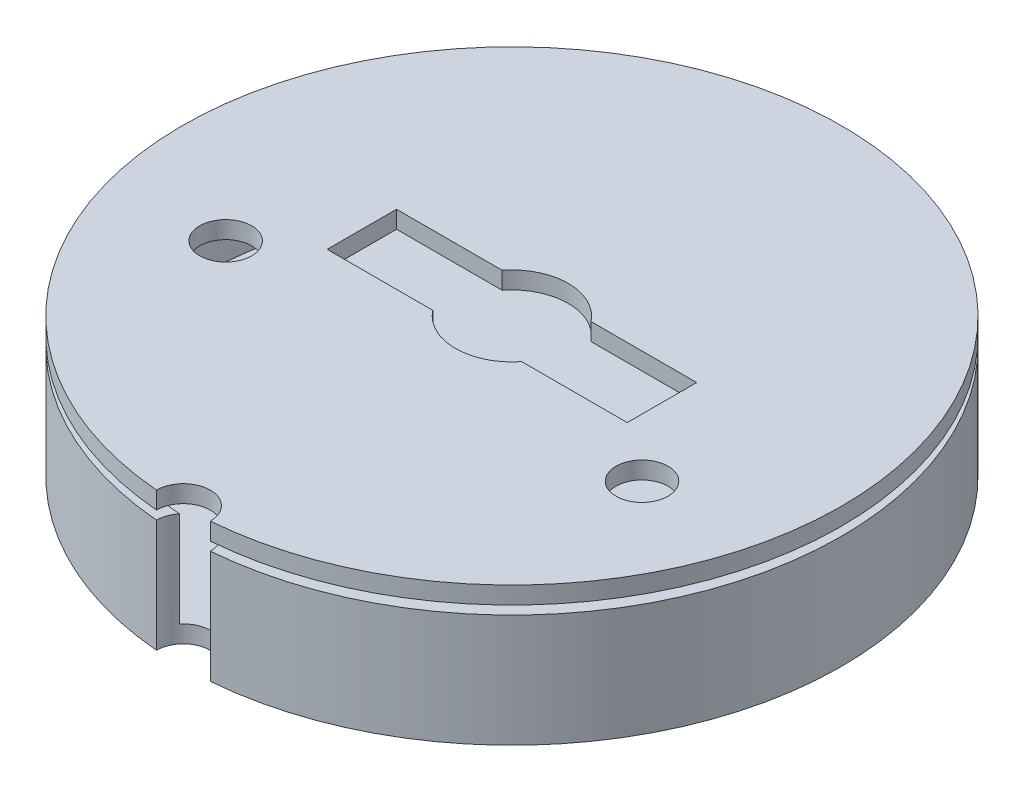
ISO-10303-21;
HEADER;
FILE_DESCRIPTION(('STEP AP214'),'2;1');
FILE_NAME('part.step','',(''),(''),'','','');
FILE_SCHEMA(('AUTOMOTIVE_DESIGN { 1 0 10303 214 1 1 1 1 }'));
ENDSEC;
DATA;
#1=APPLICATION_CONTEXT('core data for automotive mechanical design processes');
#2=APPLICATION_PROTOCOL_DEFINITION('international standard','automotive_design',2000,#1);
#3=PRODUCT_CONTEXT('',#1,'mechanical');
#4=PRODUCT('Part','Part','',(#3));
#5=PRODUCT_RELATED_PRODUCT_CATEGORY('part','',(#4));
#6=PRODUCT_DEFINITION_FORMATION('','',#4);
#7=PRODUCT_DEFINITION_CONTEXT('part definition',#1,'design');
#8=PRODUCT_DEFINITION('design','',#6,#7);
#9=PRODUCT_DEFINITION_SHAPE('','',#8);
#10=(LENGTH_UNIT() NAMED_UNIT(*) SI_UNIT(.MILLI.,.METRE.));
#11=(NAMED_UNIT(*) PLANE_ANGLE_UNIT() SI_UNIT($,.RADIAN.));
#12=(NAMED_UNIT(*) SI_UNIT($,.STERADIAN.) SOLID_ANGLE_UNIT());
#13=UNCERTAINTY_MEASURE_WITH_UNIT(LENGTH_MEASURE(1.E-05),#10,'distance_accuracy_value','');
#14=(GEOMETRIC_REPRESENTATION_CONTEXT(3) GLOBAL_UNCERTAINTY_ASSIGNED_CONTEXT((#13)) GLOBAL_UNIT_ASSIGNED_CONTEXT((#10,
#11,#12)) REPRESENTATION_CONTEXT('',''));
#15=CARTESIAN_POINT('',(0.,0.,0.));
#16=DIRECTION('',(0.,0.,1.));
#17=DIRECTION('',(1.,0.,0.));
#18=AXIS2_PLACEMENT_3D('',#15,#16,#17);
#19=CARTESIAN_POINT('',(0.,20.32,24.0495718828839));
#20=DIRECTION('',(0.,1.,0.));
#21=DIRECTION('',(0.,0.,1.));
#22=AXIS2_PLACEMENT_3D('',#19,#20,#21);
#23=PLANE('',#22);
#24=CARTESIAN_POINT('',(-30.48,20.32,11.43));
#25=DIRECTION('',(0.,1.,0.));
#26=DIRECTION('',(0.,0.,1.));
#27=AXIS2_PLACEMENT_3D('',#24,#25,#26);
#28=CIRCLE('',#27,3.81);
#29=CARTESIAN_POINT('',(-30.48,20.32,15.24));
#30=VERTEX_POINT('',#29);
#31=EDGE_CURVE('E142',#30,#30,#28,.F.);
#32=ORIENTED_EDGE('',*,*,#31,.T.);
#33=EDGE_LOOP('',(#32));
#34=FACE_BOUND('',#33,.T.);
#35=CARTESIAN_POINT('',(30.48,20.32,11.43));
#36=DIRECTION('',(0.,1.,0.));
#37=DIRECTION('',(0.,0.,1.));
#38=AXIS2_PLACEMENT_3D('',#35,#36,#37);
#39=CIRCLE('',#38,3.81);
#40=CARTESIAN_POINT('',(30.48,20.32,15.24));
#41=VERTEX_POINT('',#40);
#42=EDGE_CURVE('E165',#41,#41,#39,.F.);
#43=ORIENTED_EDGE('',*,*,#42,.T.);
#44=EDGE_LOOP('',(#43));
#45=FACE_BOUND('',#44,.T.);
#46=CARTESIAN_POINT('',(0.,20.32,48.0991437657678));
#47=DIRECTION('',(0.,-1.,0.));
#48=DIRECTION('',(0.,0.,1.));
#49=AXIS2_PLACEMENT_3D('',#46,#47,#48);
#50=CIRCLE('',#49,3.937);
#51=CARTESIAN_POINT('',(-3.937,20.32,48.0991437657678));
#52=VERTEX_POINT('',#51);
#53=CARTESIAN_POINT('',(3.937,20.32,48.0991437657678));
#54=VERTEX_POINT('',#53);
#55=EDGE_CURVE('E209',#52,#54,#50,.T.);
#56=ORIENTED_EDGE('',*,*,#55,.T.);
#57=CARTESIAN_POINT('',(0.,20.32,0.));
#58=DIRECTION('',(0.,1.,0.));
#59=DIRECTION('',(0.,0.,1.));
#60=AXIS2_PLACEMENT_3D('',#57,#58,#59);
#61=CIRCLE('',#60,48.26);
#62=EDGE_CURVE('E145',#54,#52,#61,.T.);
#63=ORIENTED_EDGE('',*,*,#62,.T.);
#64=EDGE_LOOP('',(#56,#63));
#65=FACE_BOUND('',#64,.T.);
#66=CARTESIAN_POINT('',(0.,20.32,0.));
#67=DIRECTION('',(0.,1.,0.));
#68=DIRECTION('',(0.,0.,1.));
#69=AXIS2_PLACEMENT_3D('',#66,#67,#68);
#70=CIRCLE('',#69,8.255);
#71=CARTESIAN_POINT('',(-6.50681373638434,20.32,-5.08));
#72=VERTEX_POINT('',#71);
#73=CARTESIAN_POINT('',(6.50681373638434,20.32,-5.08));
#74=VERTEX_POINT('',#73);
#75=EDGE_CURVE('E157',#72,#74,#70,.F.);
#76=ORIENTED_EDGE('',*,*,#75,.T.);
#77=DIRECTION('',(1.,0.,0.));
#78=VECTOR('',#77,1.);
#79=CARTESIAN_POINT('',(0.,20.32,-5.08));
#80=LINE('',#79,#78);
#81=CARTESIAN_POINT('',(21.971,20.32,-5.08));
#82=VERTEX_POINT('',#81);
#83=EDGE_CURVE('E200',#74,#82,#80,.T.);
#84=ORIENTED_EDGE('',*,*,#83,.T.);
#85=DIRECTION('',(0.,0.,1.));
#86=VECTOR('',#85,1.);
#87=CARTESIAN_POINT('',(21.971,20.32,24.0495718828839));
#88=LINE('',#87,#86);
#89=CARTESIAN_POINT('',(21.971,20.32,5.08));
#90=VERTEX_POINT('',#89);
#91=EDGE_CURVE('E160',#82,#90,#88,.T.);
#92=ORIENTED_EDGE('',*,*,#91,.T.);
#93=DIRECTION('',(-1.,0.,0.));
#94=VECTOR('',#93,1.);
#95=CARTESIAN_POINT('',(0.,20.32,5.08));
#96=LINE('',#95,#94);
#97=CARTESIAN_POINT('',(6.50681373638434,20.32,5.08));
#98=VERTEX_POINT('',#97);
#99=EDGE_CURVE('E191',#90,#98,#96,.T.);
#100=ORIENTED_EDGE('',*,*,#99,.T.);
#101=CARTESIAN_POINT('',(-6.50681373638434,20.32,5.08));
#102=VERTEX_POINT('',#101);
#103=EDGE_CURVE('E135',#98,#102,#70,.F.);
#104=ORIENTED_EDGE('',*,*,#103,.T.);
#105=CARTESIAN_POINT('',(-21.971,20.32,5.08));
#106=VERTEX_POINT('',#105);
#107=EDGE_CURVE('E187',#102,#106,#96,.T.);
#108=ORIENTED_EDGE('',*,*,#107,.T.);
#109=DIRECTION('',(0.,0.,-1.));
#110=VECTOR('',#109,1.);
#111=CARTESIAN_POINT('',(-21.971,20.32,24.0495718828839));
#112=LINE('',#111,#110);
#113=CARTESIAN_POINT('',(-21.971,20.32,-5.08));
#114=VERTEX_POINT('',#113);
#115=EDGE_CURVE('E194',#106,#114,#112,.T.);
#116=ORIENTED_EDGE('',*,*,#115,.T.);
#117=EDGE_CURVE('E204',#114,#72,#80,.T.);
#118=ORIENTED_EDGE('',*,*,#117,.T.);
#119=EDGE_LOOP('',(#76,#84,#92,#100,#104,#108,#116,#118));
#120=FACE_BOUND('',#119,.T.);
#121=ADVANCED_FACE('F47',(#34,#45,#65,#120),#23,.T.);
#122=CARTESIAN_POINT('',(21.971,38.608,5.08));
#123=DIRECTION('',(-1.,0.,0.));
#124=DIRECTION('',(0.,0.,1.));
#125=AXIS2_PLACEMENT_3D('',#122,#123,#124);
#126=PLANE('',#125);
#127=DIRECTION('',(0.,-1.,0.));
#128=VECTOR('',#127,1.);
#129=CARTESIAN_POINT('',(21.971,38.608,-5.08));
#130=LINE('',#129,#128);
#131=CARTESIAN_POINT('',(21.971,17.78,-5.08));
#132=VERTEX_POINT('',#131);
#133=EDGE_CURVE('E183',#82,#132,#130,.T.);
#134=ORIENTED_EDGE('',*,*,#133,.T.);
#135=DIRECTION('',(0.,0.,1.));
#136=VECTOR('',#135,1.);
#137=CARTESIAN_POINT('',(21.971,17.78,0.));
#138=LINE('',#137,#136);
#139=CARTESIAN_POINT('',(21.971,17.78,5.08));
#140=VERTEX_POINT('',#139);
#141=EDGE_CURVE('E56',#132,#140,#138,.T.);
#142=ORIENTED_EDGE('',*,*,#141,.T.);
#143=DIRECTION('',(0.,-1.,0.));
#144=VECTOR('',#143,1.);
#145=CARTESIAN_POINT('',(21.971,38.608,5.08));
#146=LINE('',#145,#144);
#147=EDGE_CURVE('E65',#90,#140,#146,.T.);
#148=ORIENTED_EDGE('',*,*,#147,.F.);
#149=ORIENTED_EDGE('',*,*,#91,.F.);
#150=EDGE_LOOP('',(#134,#142,#148,#149));
#151=FACE_BOUND('',#150,.T.);
#152=ADVANCED_FACE('F213',(#151),#126,.T.);
#153=CARTESIAN_POINT('',(-21.971,38.608,5.08));
#154=DIRECTION('',(0.,0.,-1.));
#155=DIRECTION('',(-1.,0.,0.));
#156=AXIS2_PLACEMENT_3D('',#153,#154,#155);
#157=PLANE('',#156);
#158=ORIENTED_EDGE('',*,*,#147,.T.);
#159=DIRECTION('',(-1.,0.,0.));
#160=VECTOR('',#159,1.);
#161=CARTESIAN_POINT('',(0.,17.78,5.08));
#162=LINE('',#161,#160);
#163=CARTESIAN_POINT('',(6.50681373638435,17.78,5.08));
#164=VERTEX_POINT('',#163);
#165=EDGE_CURVE('E151',#140,#164,#162,.T.);
#166=ORIENTED_EDGE('',*,*,#165,.T.);
#167=DIRECTION('',(0.,-1.,0.));
#168=VECTOR('',#167,1.);
#169=CARTESIAN_POINT('',(6.50681373638434,50.038,5.08));
#170=LINE('',#169,#168);
#171=EDGE_CURVE('E190',#98,#164,#170,.T.);
#172=ORIENTED_EDGE('',*,*,#171,.F.);
#173=ORIENTED_EDGE('',*,*,#99,.F.);
#174=EDGE_LOOP('',(#158,#166,#172,#173));
#175=FACE_BOUND('',#174,.T.);
#176=ADVANCED_FACE('F263',(#175),#157,.T.);
#177=CARTESIAN_POINT('',(0.,50.038,0.));
#178=DIRECTION('',(0.,-1.,0.));
#179=DIRECTION('',(0.,0.,-1.));
#180=AXIS2_PLACEMENT_3D('',#177,#178,#179);
#181=CYLINDRICAL_SURFACE('',#180,8.255);
#182=ORIENTED_EDGE('',*,*,#103,.F.);
#183=ORIENTED_EDGE('',*,*,#171,.T.);
#184=CARTESIAN_POINT('',(0.,17.78,0.));
#185=DIRECTION('',(0.,1.,0.));
#186=DIRECTION('',(0.,0.,1.));
#187=AXIS2_PLACEMENT_3D('',#184,#185,#186);
#188=CIRCLE('',#187,8.255);
#189=CARTESIAN_POINT('',(-6.50681373638435,17.78,5.08));
#190=VERTEX_POINT('',#189);
#191=EDGE_CURVE('E158',#190,#164,#188,.T.);
#192=ORIENTED_EDGE('',*,*,#191,.F.);
#193=DIRECTION('',(0.,-1.,0.));
#194=VECTOR('',#193,1.);
#195=CARTESIAN_POINT('',(-6.50681373638434,50.038,5.08));
#196=LINE('',#195,#194);
#197=EDGE_CURVE('E73',#190,#102,#196,.F.);
#198=ORIENTED_EDGE('',*,*,#197,.T.);
#199=EDGE_LOOP('',(#182,#183,#192,#198));
#200=FACE_BOUND('',#199,.T.);
#201=ADVANCED_FACE('F234',(#200),#181,.F.);
#202=ORIENTED_EDGE('',*,*,#197,.F.);
#203=CARTESIAN_POINT('',(-21.971,17.78,5.08));
#204=VERTEX_POINT('',#203);
#205=EDGE_CURVE('E147',#190,#204,#162,.T.);
#206=ORIENTED_EDGE('',*,*,#205,.T.);
#207=DIRECTION('',(0.,-1.,0.));
#208=VECTOR('',#207,1.);
#209=CARTESIAN_POINT('',(-21.971,38.608,5.08));
#210=LINE('',#209,#208);
#211=EDGE_CURVE('E177',#106,#204,#210,.T.);
#212=ORIENTED_EDGE('',*,*,#211,.F.);
#213=ORIENTED_EDGE('',*,*,#107,.F.);
#214=EDGE_LOOP('',(#202,#206,#212,#213));
#215=FACE_BOUND('',#214,.T.);
#216=ADVANCED_FACE('F238',(#215),#157,.T.);
#217=CARTESIAN_POINT('',(-21.971,38.608,5.08));
#218=DIRECTION('',(1.,0.,0.));
#219=DIRECTION('',(0.,0.,-1.));
#220=AXIS2_PLACEMENT_3D('',#217,#218,#219);
#221=PLANE('',#220);
#222=ORIENTED_EDGE('',*,*,#211,.T.);
#223=DIRECTION('',(0.,0.,-1.));
#224=VECTOR('',#223,1.);
#225=CARTESIAN_POINT('',(-21.971,17.78,0.));
#226=LINE('',#225,#224);
#227=CARTESIAN_POINT('',(-21.971,17.78,-5.08));
#228=VERTEX_POINT('',#227);
#229=EDGE_CURVE('E149',#204,#228,#226,.T.);
#230=ORIENTED_EDGE('',*,*,#229,.T.);
#231=DIRECTION('',(0.,-1.,0.));
#232=VECTOR('',#231,1.);
#233=CARTESIAN_POINT('',(-21.971,38.608,-5.08));
#234=LINE('',#233,#232);
#235=EDGE_CURVE('E180',#114,#228,#234,.T.);
#236=ORIENTED_EDGE('',*,*,#235,.F.);
#237=ORIENTED_EDGE('',*,*,#115,.F.);
#238=EDGE_LOOP('',(#222,#230,#236,#237));
#239=FACE_BOUND('',#238,.T.);
#240=ADVANCED_FACE('F240',(#239),#221,.T.);
#241=CARTESIAN_POINT('',(-21.971,38.608,-5.08));
#242=DIRECTION('',(0.,0.,1.));
#243=DIRECTION('',(1.,0.,0.));
#244=AXIS2_PLACEMENT_3D('',#241,#242,#243);
#245=PLANE('',#244);
#246=ORIENTED_EDGE('',*,*,#235,.T.);
#247=DIRECTION('',(1.,0.,0.));
#248=VECTOR('',#247,1.);
#249=CARTESIAN_POINT('',(0.,17.78,-5.08));
#250=LINE('',#249,#248);
#251=CARTESIAN_POINT('',(-6.50681373638434,17.78,-5.08));
#252=VERTEX_POINT('',#251);
#253=EDGE_CURVE('E58',#228,#252,#250,.T.);
#254=ORIENTED_EDGE('',*,*,#253,.T.);
#255=DIRECTION('',(0.,-1.,0.));
#256=VECTOR('',#255,1.);
#257=CARTESIAN_POINT('',(-6.50681373638434,50.038,-5.08));
#258=LINE('',#257,#256);
#259=EDGE_CURVE('E203',#72,#252,#258,.T.);
#260=ORIENTED_EDGE('',*,*,#259,.F.);
#261=ORIENTED_EDGE('',*,*,#117,.F.);
#262=EDGE_LOOP('',(#246,#254,#260,#261));
#263=FACE_BOUND('',#262,.T.);
#264=ADVANCED_FACE('F243',(#263),#245,.T.);
#265=ORIENTED_EDGE('',*,*,#75,.F.);
#266=ORIENTED_EDGE('',*,*,#259,.T.);
#267=CARTESIAN_POINT('',(6.50681373638434,17.78,-5.08));
#268=VERTEX_POINT('',#267);
#269=EDGE_CURVE('E136',#268,#252,#188,.T.);
#270=ORIENTED_EDGE('',*,*,#269,.F.);
#271=DIRECTION('',(0.,-1.,0.));
#272=VECTOR('',#271,1.);
#273=CARTESIAN_POINT('',(6.50681373638434,50.038,-5.08));
#274=LINE('',#273,#272);
#275=EDGE_CURVE('E197',#268,#74,#274,.F.);
#276=ORIENTED_EDGE('',*,*,#275,.T.);
#277=EDGE_LOOP('',(#265,#266,#270,#276));
#278=FACE_BOUND('',#277,.T.);
#279=ADVANCED_FACE('F220',(#278),#181,.F.);
#280=ORIENTED_EDGE('',*,*,#275,.F.);
#281=EDGE_CURVE('E13',#268,#132,#250,.T.);
#282=ORIENTED_EDGE('',*,*,#281,.T.);
#283=ORIENTED_EDGE('',*,*,#133,.F.);
#284=ORIENTED_EDGE('',*,*,#83,.F.);
#285=EDGE_LOOP('',(#280,#282,#283,#284));
#286=FACE_BOUND('',#285,.T.);
#287=ADVANCED_FACE('F225',(#286),#245,.T.);
#288=CARTESIAN_POINT('',(0.,20.32,0.));
#289=DIRECTION('',(0.,-1.,0.));
#290=DIRECTION('',(0.,0.,-1.));
#291=AXIS2_PLACEMENT_3D('',#288,#289,#290);
#292=CYLINDRICAL_SURFACE('',#291,48.26);
#293=CARTESIAN_POINT('',(0.,17.78,0.));
#294=DIRECTION('',(0.,-1.,0.));
#295=DIRECTION('',(0.,0.,-1.));
#296=AXIS2_PLACEMENT_3D('',#293,#294,#295);
#297=CIRCLE('',#296,48.26);
#298=CARTESIAN_POINT('',(-3.937,17.78,48.0991437657678));
#299=VERTEX_POINT('',#298);
#300=CARTESIAN_POINT('',(3.937,17.78,48.0991437657678));
#301=VERTEX_POINT('',#300);
#302=EDGE_CURVE('E138',#299,#301,#297,.T.);
#303=ORIENTED_EDGE('',*,*,#302,.F.);
#304=DIRECTION('',(0.,-1.,0.));
#305=VECTOR('',#304,1.);
#306=CARTESIAN_POINT('',(-3.937,20.32,48.0991437657678));
#307=LINE('',#306,#305);
#308=EDGE_CURVE('E132',#52,#299,#307,.T.);
#309=ORIENTED_EDGE('',*,*,#308,.F.);
#310=ORIENTED_EDGE('',*,*,#62,.F.);
#311=DIRECTION('',(0.,-1.,0.));
#312=VECTOR('',#311,1.);
#313=CARTESIAN_POINT('',(3.937,20.32,48.0991437657678));
#314=LINE('',#313,#312);
#315=EDGE_CURVE('E130',#54,#301,#314,.T.);
#316=ORIENTED_EDGE('',*,*,#315,.T.);
#317=EDGE_LOOP('',(#303,#309,#310,#316));
#318=FACE_BOUND('',#317,.T.);
#319=ADVANCED_FACE('F144',(#318),#292,.T.);
#320=CARTESIAN_POINT('',(0.,17.78,0.));
#321=DIRECTION('',(0.,1.,0.));
#322=DIRECTION('',(0.,0.,1.));
#323=AXIS2_PLACEMENT_3D('',#320,#321,#322);
#324=PLANE('',#323);
#325=CARTESIAN_POINT('',(-30.48,17.78,11.43));
#326=DIRECTION('',(0.,1.,0.));
#327=DIRECTION('',(0.,0.,1.));
#328=AXIS2_PLACEMENT_3D('',#325,#326,#327);
#329=CIRCLE('',#328,3.81);
#330=CARTESIAN_POINT('',(-30.48,17.78,15.24));
#331=VERTEX_POINT('',#330);
#332=EDGE_CURVE('E51',#331,#331,#329,.F.);
#333=ORIENTED_EDGE('',*,*,#332,.F.);
#334=EDGE_LOOP('',(#333));
#335=FACE_BOUND('',#334,.T.);
#336=CARTESIAN_POINT('',(30.48,17.78,11.43));
#337=DIRECTION('',(0.,1.,0.));
#338=DIRECTION('',(0.,0.,1.));
#339=AXIS2_PLACEMENT_3D('',#336,#337,#338);
#340=CIRCLE('',#339,3.81);
#341=CARTESIAN_POINT('',(30.48,17.78,15.24));
#342=VERTEX_POINT('',#341);
#343=EDGE_CURVE('E163',#342,#342,#340,.F.);
#344=ORIENTED_EDGE('',*,*,#343,.F.);
#345=EDGE_LOOP('',(#344));
#346=FACE_BOUND('',#345,.T.);
#347=CARTESIAN_POINT('',(0.,17.78,48.0991437657678));
#348=DIRECTION('',(0.,1.,0.));
#349=DIRECTION('',(0.,0.,1.));
#350=AXIS2_PLACEMENT_3D('',#347,#348,#349);
#351=CIRCLE('',#350,3.937);
#352=EDGE_CURVE('E126',#299,#301,#351,.F.);
#353=ORIENTED_EDGE('',*,*,#352,.F.);
#354=ORIENTED_EDGE('',*,*,#302,.T.);
#355=EDGE_LOOP('',(#353,#354));
#356=FACE_BOUND('',#355,.T.);
#357=ORIENTED_EDGE('',*,*,#281,.F.);
#358=ORIENTED_EDGE('',*,*,#269,.T.);
#359=ORIENTED_EDGE('',*,*,#253,.F.);
#360=ORIENTED_EDGE('',*,*,#229,.F.);
#361=ORIENTED_EDGE('',*,*,#205,.F.);
#362=ORIENTED_EDGE('',*,*,#191,.T.);
#363=ORIENTED_EDGE('',*,*,#165,.F.);
#364=ORIENTED_EDGE('',*,*,#141,.F.);
#365=EDGE_LOOP('',(#357,#358,#359,#360,#361,#362,#363,#364));
#366=FACE_BOUND('',#365,.T.);
#367=ADVANCED_FACE('F139',(#335,#346,#356,#366),#324,.F.);
#368=CARTESIAN_POINT('',(0.,20.32,48.0991437657678));
#369=DIRECTION('',(0.,-1.,0.));
#370=DIRECTION('',(0.,0.,-1.));
#371=AXIS2_PLACEMENT_3D('',#368,#369,#370);
#372=CYLINDRICAL_SURFACE('',#371,3.937);
#373=ORIENTED_EDGE('',*,*,#308,.T.);
#374=ORIENTED_EDGE('',*,*,#352,.T.);
#375=ORIENTED_EDGE('',*,*,#315,.F.);
#376=ORIENTED_EDGE('',*,*,#55,.F.);
#377=EDGE_LOOP('',(#373,#374,#375,#376));
#378=FACE_BOUND('',#377,.T.);
#379=ADVANCED_FACE('F49',(#378),#372,.F.);
#380=CARTESIAN_POINT('',(30.48,39.37,11.43));
#381=DIRECTION('',(0.,-1.,0.));
#382=DIRECTION('',(0.,0.,-1.));
#383=AXIS2_PLACEMENT_3D('',#380,#381,#382);
#384=CYLINDRICAL_SURFACE('',#383,3.81);
#385=ORIENTED_EDGE('',*,*,#42,.F.);
#386=EDGE_LOOP('',(#385));
#387=FACE_BOUND('',#386,.T.);
#388=ORIENTED_EDGE('',*,*,#343,.T.);
#389=EDGE_LOOP('',(#388));
#390=FACE_BOUND('',#389,.T.);
#391=ADVANCED_FACE('F317',(#387,#390),#384,.F.);
#392=CARTESIAN_POINT('',(-30.48,39.37,11.43));
#393=DIRECTION('',(0.,-1.,0.));
#394=DIRECTION('',(0.,0.,-1.));
#395=AXIS2_PLACEMENT_3D('',#392,#393,#394);
#396=CYLINDRICAL_SURFACE('',#395,3.81);
#397=ORIENTED_EDGE('',*,*,#31,.F.);
#398=EDGE_LOOP('',(#397));
#399=FACE_BOUND('',#398,.T.);
#400=ORIENTED_EDGE('',*,*,#332,.T.);
#401=EDGE_LOOP('',(#400));
#402=FACE_BOUND('',#401,.T.);
#403=ADVANCED_FACE('F324',(#399,#402),#396,.F.);
#404=CLOSED_SHELL('',(#121,#152,#176,#201,#216,#240,#264,#279,#287,#319,#367,#379,#391,#403));
#405=MANIFOLD_SOLID_BREP('B2',#404);
#406=CARTESIAN_POINT('',(0.,20.32,48.0991437657678));
#407=DIRECTION('',(0.,-1.,0.));
#408=DIRECTION('',(0.,0.,-1.));
#409=AXIS2_PLACEMENT_3D('',#406,#407,#408);
#410=CYLINDRICAL_SURFACE('',#409,3.937);
#411=CARTESIAN_POINT('',(0.,16.51,48.0991437657678));
#412=DIRECTION('',(0.,1.,0.));
#413=DIRECTION('',(0.,0.,1.));
#414=AXIS2_PLACEMENT_3D('',#411,#412,#413);
#415=CIRCLE('',#414,3.937);
#416=CARTESIAN_POINT('',(-3.937,16.51,48.0991437657678));
#417=VERTEX_POINT('',#416);
#418=CARTESIAN_POINT('',(-3.05654709958745,16.51,45.617714978153));
#419=VERTEX_POINT('',#418);
#420=EDGE_CURVE('E378',#417,#419,#415,.F.);
#421=ORIENTED_EDGE('',*,*,#420,.F.);
#422=DIRECTION('',(0.,-1.,0.));
#423=VECTOR('',#422,1.);
#424=CARTESIAN_POINT('',(-3.937,20.32,48.0991437657678));
#425=LINE('',#424,#423);
#426=CARTESIAN_POINT('',(-3.937,0.,48.0991437657678));
#427=VERTEX_POINT('',#426);
#428=EDGE_CURVE('E434',#417,#427,#425,.T.);
#429=ORIENTED_EDGE('',*,*,#428,.T.);
#430=CARTESIAN_POINT('',(0.,0.,48.0991437657678));
#431=DIRECTION('',(0.,-1.,0.));
#432=DIRECTION('',(0.,0.,1.));
#433=AXIS2_PLACEMENT_3D('',#430,#431,#432);
#434=CIRCLE('',#433,3.937);
#435=CARTESIAN_POINT('',(3.937,0.,48.0991437657678));
#436=VERTEX_POINT('',#435);
#437=EDGE_CURVE('E423',#427,#436,#434,.T.);
#438=ORIENTED_EDGE('',*,*,#437,.T.);
#439=DIRECTION('',(0.,-1.,0.));
#440=VECTOR('',#439,1.);
#441=CARTESIAN_POINT('',(3.937,20.32,48.0991437657678));
#442=LINE('',#441,#440);
#443=CARTESIAN_POINT('',(3.937,16.51,48.0991437657678));
#444=VERTEX_POINT('',#443);
#445=EDGE_CURVE('E419',#444,#436,#442,.T.);
#446=ORIENTED_EDGE('',*,*,#445,.F.);
#447=CARTESIAN_POINT('',(3.05654709958746,16.51,45.617714978153));
#448=VERTEX_POINT('',#447);
#449=EDGE_CURVE('E45',#448,#444,#415,.F.);
#450=ORIENTED_EDGE('',*,*,#449,.F.);
#451=DIRECTION('',(0.,1.,0.));
#452=VECTOR('',#451,1.);
#453=CARTESIAN_POINT('',(3.05654709958745,10.16,45.617714978153));
#454=LINE('',#453,#452);
#455=CARTESIAN_POINT('',(3.05654709958748,2.54,45.617714978153));
#456=VERTEX_POINT('',#455);
#457=EDGE_CURVE('E414',#448,#456,#454,.F.);
#458=ORIENTED_EDGE('',*,*,#457,.T.);
#459=CARTESIAN_POINT('',(0.,2.54,48.0991437657678));
#460=DIRECTION('',(0.,1.,0.));
#461=DIRECTION('',(0.,0.,1.));
#462=AXIS2_PLACEMENT_3D('',#459,#460,#461);
#463=CIRCLE('',#462,3.937);
#464=CARTESIAN_POINT('',(-3.05654709958748,2.54,45.617714978153));
#465=VERTEX_POINT('',#464);
#466=EDGE_CURVE('E418',#465,#456,#463,.F.);
#467=ORIENTED_EDGE('',*,*,#466,.F.);
#468=DIRECTION('',(0.,1.,0.));
#469=VECTOR('',#468,1.);
#470=CARTESIAN_POINT('',(-3.05654709958745,10.16,45.617714978153));
#471=LINE('',#470,#469);
#472=EDGE_CURVE('E412',#465,#419,#471,.T.);
#473=ORIENTED_EDGE('',*,*,#472,.T.);
#474=EDGE_LOOP('',(#421,#429,#438,#446,#450,#458,#467,#473));
#475=FACE_BOUND('',#474,.T.);
#476=ADVANCED_FACE('F367',(#475),#410,.F.);
#477=CARTESIAN_POINT('',(0.,20.32,0.));
#478=DIRECTION('',(0.,-1.,0.));
#479=DIRECTION('',(0.,0.,-1.));
#480=AXIS2_PLACEMENT_3D('',#477,#478,#479);
#481=CYLINDRICAL_SURFACE('',#480,48.26);
#482=CARTESIAN_POINT('',(0.,16.51,0.));
#483=DIRECTION('',(0.,1.,0.));
#484=DIRECTION('',(0.,0.,1.));
#485=AXIS2_PLACEMENT_3D('',#482,#483,#484);
#486=CIRCLE('',#485,48.26);
#487=EDGE_CURVE('E404',#444,#417,#486,.T.);
#488=ORIENTED_EDGE('',*,*,#487,.F.);
#489=ORIENTED_EDGE('',*,*,#445,.T.);
#490=CARTESIAN_POINT('',(0.,0.,0.));
#491=DIRECTION('',(0.,1.,0.));
#492=DIRECTION('',(0.,0.,1.));
#493=AXIS2_PLACEMENT_3D('',#490,#491,#492);
#494=CIRCLE('',#493,48.26);
#495=EDGE_CURVE('E421',#436,#427,#494,.T.);
#496=ORIENTED_EDGE('',*,*,#495,.T.);
#497=ORIENTED_EDGE('',*,*,#428,.F.);
#498=EDGE_LOOP('',(#488,#489,#496,#497));
#499=FACE_BOUND('',#498,.T.);
#500=ADVANCED_FACE('F480',(#499),#481,.T.);
#501=CARTESIAN_POINT('',(0.,2.54,0.));
#502=DIRECTION('',(0.,1.,0.));
#503=DIRECTION('',(0.,0.,1.));
#504=AXIS2_PLACEMENT_3D('',#501,#502,#503);
#505=CYLINDRICAL_SURFACE('',#504,45.72);
#506=CARTESIAN_POINT('',(0.,16.51,0.));
#507=DIRECTION('',(0.,1.,0.));
#508=DIRECTION('',(0.,0.,1.));
#509=AXIS2_PLACEMENT_3D('',#506,#507,#508);
#510=CIRCLE('',#509,45.72);
#511=EDGE_CURVE('E376',#419,#448,#510,.F.);
#512=ORIENTED_EDGE('',*,*,#511,.F.);
#513=ORIENTED_EDGE('',*,*,#472,.F.);
#514=CARTESIAN_POINT('',(0.,2.54,0.));
#515=DIRECTION('',(0.,1.,0.));
#516=DIRECTION('',(0.,0.,1.));
#517=AXIS2_PLACEMENT_3D('',#514,#515,#516);
#518=CIRCLE('',#517,45.72);
#519=EDGE_CURVE('E438',#456,#465,#518,.T.);
#520=ORIENTED_EDGE('',*,*,#519,.F.);
#521=ORIENTED_EDGE('',*,*,#457,.F.);
#522=EDGE_LOOP('',(#512,#513,#520,#521));
#523=FACE_BOUND('',#522,.T.);
#524=ADVANCED_FACE('F410',(#523),#505,.F.);
#525=CARTESIAN_POINT('',(0.,20.32,0.));
#526=DIRECTION('',(0.,-1.,0.));
#527=DIRECTION('',(0.,0.,-1.));
#528=AXIS2_PLACEMENT_3D('',#525,#526,#527);
#529=CYLINDRICAL_SURFACE('',#528,5.588);
#530=CARTESIAN_POINT('',(0.,0.,0.));
#531=DIRECTION('',(0.,1.,0.));
#532=DIRECTION('',(0.,0.,1.));
#533=AXIS2_PLACEMENT_3D('',#530,#531,#532);
#534=CIRCLE('',#533,5.588);
#535=CARTESIAN_POINT('',(0.,0.,5.588));
#536=VERTEX_POINT('',#535);
#537=EDGE_CURVE('E429',#536,#536,#534,.T.);
#538=ORIENTED_EDGE('',*,*,#537,.F.);
#539=EDGE_LOOP('',(#538));
#540=FACE_BOUND('',#539,.T.);
#541=CARTESIAN_POINT('',(0.,2.54,0.));
#542=DIRECTION('',(0.,1.,0.));
#543=DIRECTION('',(0.,0.,1.));
#544=AXIS2_PLACEMENT_3D('',#541,#542,#543);
#545=CIRCLE('',#544,5.588);
#546=CARTESIAN_POINT('',(0.,2.54,5.588));
#547=VERTEX_POINT('',#546);
#548=EDGE_CURVE('E426',#547,#547,#545,.T.);
#549=ORIENTED_EDGE('',*,*,#548,.T.);
#550=EDGE_LOOP('',(#549));
#551=FACE_BOUND('',#550,.T.);
#552=ADVANCED_FACE('F488',(#540,#551),#529,.F.);
#553=CARTESIAN_POINT('',(0.,0.,24.0495718828839));
#554=DIRECTION('',(0.,1.,0.));
#555=DIRECTION('',(0.,0.,1.));
#556=AXIS2_PLACEMENT_3D('',#553,#554,#555);
#557=PLANE('',#556);
#558=CARTESIAN_POINT('',(-30.48,0.,11.43));
#559=DIRECTION('',(0.,1.,0.));
#560=DIRECTION('',(0.,0.,1.));
#561=AXIS2_PLACEMENT_3D('',#558,#559,#560);
#562=CIRCLE('',#561,3.81);
#563=CARTESIAN_POINT('',(-30.48,0.,15.24));
#564=VERTEX_POINT('',#563);
#565=EDGE_CURVE('E443',#564,#564,#562,.T.);
#566=ORIENTED_EDGE('',*,*,#565,.T.);
#567=EDGE_LOOP('',(#566));
#568=FACE_BOUND('',#567,.T.);
#569=CARTESIAN_POINT('',(30.48,0.,11.43));
#570=DIRECTION('',(0.,1.,0.));
#571=DIRECTION('',(0.,0.,-1.));
#572=AXIS2_PLACEMENT_3D('',#569,#570,#571);
#573=CIRCLE('',#572,3.81);
#574=CARTESIAN_POINT('',(30.48,0.,7.62));
#575=VERTEX_POINT('',#574);
#576=EDGE_CURVE('E448',#575,#575,#573,.T.);
#577=ORIENTED_EDGE('',*,*,#576,.T.);
#578=EDGE_LOOP('',(#577));
#579=FACE_BOUND('',#578,.T.);
#580=ORIENTED_EDGE('',*,*,#437,.F.);
#581=ORIENTED_EDGE('',*,*,#495,.F.);
#582=EDGE_LOOP('',(#580,#581));
#583=FACE_BOUND('',#582,.T.);
#584=ORIENTED_EDGE('',*,*,#537,.T.);
#585=EDGE_LOOP('',(#584));
#586=FACE_BOUND('',#585,.T.);
#587=ADVANCED_FACE('F456',(#568,#579,#583,#586),#557,.F.);
#588=CARTESIAN_POINT('',(0.,2.54,0.));
#589=DIRECTION('',(0.,1.,0.));
#590=DIRECTION('',(0.,0.,1.));
#591=AXIS2_PLACEMENT_3D('',#588,#589,#590);
#592=PLANE('',#591);
#593=CARTESIAN_POINT('',(-30.48,2.54,11.43));
#594=DIRECTION('',(0.,1.,0.));
#595=DIRECTION('',(0.,0.,1.));
#596=AXIS2_PLACEMENT_3D('',#593,#594,#595);
#597=CIRCLE('',#596,3.81);
#598=CARTESIAN_POINT('',(-30.48,2.54,15.24));
#599=VERTEX_POINT('',#598);
#600=EDGE_CURVE('E370',#599,#599,#597,.F.);
#601=ORIENTED_EDGE('',*,*,#600,.T.);
#602=EDGE_LOOP('',(#601));
#603=FACE_BOUND('',#602,.T.);
#604=CARTESIAN_POINT('',(30.48,2.54,11.43));
#605=DIRECTION('',(0.,1.,0.));
#606=DIRECTION('',(0.,0.,1.));
#607=AXIS2_PLACEMENT_3D('',#604,#605,#606);
#608=CIRCLE('',#607,3.81);
#609=CARTESIAN_POINT('',(30.48,2.54,15.24));
#610=VERTEX_POINT('',#609);
#611=EDGE_CURVE('E441',#610,#610,#608,.F.);
#612=ORIENTED_EDGE('',*,*,#611,.T.);
#613=EDGE_LOOP('',(#612));
#614=FACE_BOUND('',#613,.T.);
#615=ORIENTED_EDGE('',*,*,#548,.F.);
#616=EDGE_LOOP('',(#615));
#617=FACE_BOUND('',#616,.T.);
#618=ORIENTED_EDGE('',*,*,#466,.T.);
#619=ORIENTED_EDGE('',*,*,#519,.T.);
#620=EDGE_LOOP('',(#618,#619));
#621=FACE_BOUND('',#620,.T.);
#622=ADVANCED_FACE('F462',(#603,#614,#617,#621),#592,.T.);
#623=CARTESIAN_POINT('',(30.48,39.37,11.43));
#624=DIRECTION('',(0.,-1.,0.));
#625=DIRECTION('',(0.,0.,-1.));
#626=AXIS2_PLACEMENT_3D('',#623,#624,#625);
#627=CYLINDRICAL_SURFACE('',#626,3.81);
#628=ORIENTED_EDGE('',*,*,#611,.F.);
#629=EDGE_LOOP('',(#628));
#630=FACE_BOUND('',#629,.T.);
#631=ORIENTED_EDGE('',*,*,#576,.F.);
#632=EDGE_LOOP('',(#631));
#633=FACE_BOUND('',#632,.T.);
#634=ADVANCED_FACE('F459',(#630,#633),#627,.F.);
#635=CARTESIAN_POINT('',(-30.48,39.37,11.43));
#636=DIRECTION('',(0.,-1.,0.));
#637=DIRECTION('',(0.,0.,-1.));
#638=AXIS2_PLACEMENT_3D('',#635,#636,#637);
#639=CYLINDRICAL_SURFACE('',#638,3.81);
#640=ORIENTED_EDGE('',*,*,#600,.F.);
#641=EDGE_LOOP('',(#640));
#642=FACE_BOUND('',#641,.T.);
#643=ORIENTED_EDGE('',*,*,#565,.F.);
#644=EDGE_LOOP('',(#643));
#645=FACE_BOUND('',#644,.T.);
#646=ADVANCED_FACE('F461',(#642,#645),#639,.F.);
#647=CARTESIAN_POINT('',(72.898,16.51,-55.7376732664433));
#648=DIRECTION('',(0.,1.,0.));
#649=DIRECTION('',(0.,0.,1.));
#650=AXIS2_PLACEMENT_3D('',#647,#648,#649);
#651=PLANE('',#650);
#652=ORIENTED_EDGE('',*,*,#487,.T.);
#653=ORIENTED_EDGE('',*,*,#420,.T.);
#654=ORIENTED_EDGE('',*,*,#511,.T.);
#655=ORIENTED_EDGE('',*,*,#449,.T.);
#656=EDGE_LOOP('',(#652,#653,#654,#655));
#657=FACE_BOUND('',#656,.T.);
#658=ADVANCED_FACE('F403',(#657),#651,.T.);
#659=CLOSED_SHELL('',(#476,#500,#524,#552,#587,#622,#634,#646,#658));
#660=MANIFOLD_SOLID_BREP('B7',#659);
#661=ADVANCED_BREP_SHAPE_REPRESENTATION('',(#18,#405,#660),#14);
#662=SHAPE_DEFINITION_REPRESENTATION(#9,#661);
ENDSEC;
END-ISO-10303-21;
